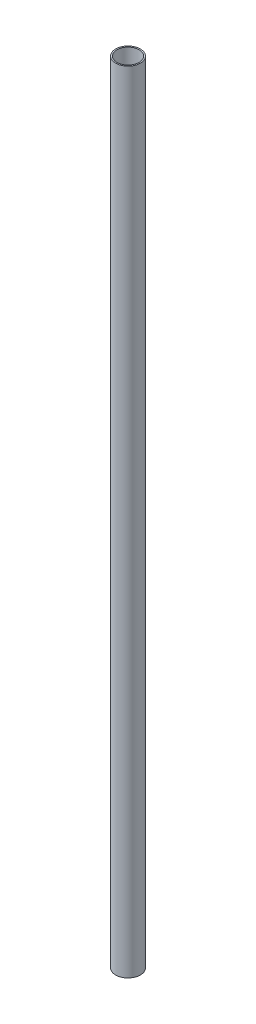
ISO-10303-21;
HEADER;
FILE_DESCRIPTION(('STEP AP214'),'2;1');
FILE_NAME('part.step','',(''),(''),'','','');
FILE_SCHEMA(('AUTOMOTIVE_DESIGN { 1 0 10303 214 1 1 1 1 }'));
ENDSEC;
DATA;
#1=APPLICATION_CONTEXT('core data for automotive mechanical design processes');
#2=APPLICATION_PROTOCOL_DEFINITION('international standard','automotive_design',2000,#1);
#3=PRODUCT_CONTEXT('',#1,'mechanical');
#4=PRODUCT('Part','Part','',(#3));
#5=PRODUCT_RELATED_PRODUCT_CATEGORY('part','',(#4));
#6=PRODUCT_DEFINITION_FORMATION('','',#4);
#7=PRODUCT_DEFINITION_CONTEXT('part definition',#1,'design');
#8=PRODUCT_DEFINITION('design','',#6,#7);
#9=PRODUCT_DEFINITION_SHAPE('','',#8);
#10=(LENGTH_UNIT() NAMED_UNIT(*) SI_UNIT(.MILLI.,.METRE.));
#11=(NAMED_UNIT(*) PLANE_ANGLE_UNIT() SI_UNIT($,.RADIAN.));
#12=(NAMED_UNIT(*) SI_UNIT($,.STERADIAN.) SOLID_ANGLE_UNIT());
#13=UNCERTAINTY_MEASURE_WITH_UNIT(LENGTH_MEASURE(1.E-05),#10,'distance_accuracy_value','');
#14=(GEOMETRIC_REPRESENTATION_CONTEXT(3) GLOBAL_UNCERTAINTY_ASSIGNED_CONTEXT((#13)) GLOBAL_UNIT_ASSIGNED_CONTEXT((#10,
#11,#12)) REPRESENTATION_CONTEXT('',''));
#15=CARTESIAN_POINT('',(0.,0.,0.));
#16=DIRECTION('',(0.,0.,1.));
#17=DIRECTION('',(1.,0.,0.));
#18=AXIS2_PLACEMENT_3D('',#15,#16,#17);
#19=CARTESIAN_POINT('',(0.,304.8,0.));
#20=DIRECTION('',(0.,1.,0.));
#21=DIRECTION('',(0.,0.,1.));
#22=AXIS2_PLACEMENT_3D('',#19,#20,#21);
#23=PLANE('',#22);
#24=CARTESIAN_POINT('',(0.,304.8,0.));
#25=DIRECTION('',(0.,1.,0.));
#26=DIRECTION('',(0.,0.,1.));
#27=AXIS2_PLACEMENT_3D('',#24,#25,#26);
#28=CIRCLE('',#27,4.7625);
#29=CARTESIAN_POINT('',(0.,304.8,-4.7625));
#30=VERTEX_POINT('',#29);
#31=EDGE_CURVE('E10',#30,#30,#28,.T.);
#32=ORIENTED_EDGE('',*,*,#31,.T.);
#33=EDGE_LOOP('',(#32));
#34=FACE_BOUND('',#33,.T.);
#35=CARTESIAN_POINT('',(0.,304.8,0.));
#36=DIRECTION('',(0.,1.,0.));
#37=DIRECTION('',(0.,0.,1.));
#38=AXIS2_PLACEMENT_3D('',#35,#36,#37);
#39=CIRCLE('',#38,4.2545);
#40=CARTESIAN_POINT('',(0.,304.8,-4.2545));
#41=VERTEX_POINT('',#40);
#42=EDGE_CURVE('E50',#41,#41,#39,.T.);
#43=ORIENTED_EDGE('',*,*,#42,.F.);
#44=EDGE_LOOP('',(#43));
#45=FACE_BOUND('',#44,.T.);
#46=ADVANCED_FACE('F37',(#34,#45),#23,.T.);
#47=CARTESIAN_POINT('',(0.,0.,0.));
#48=DIRECTION('',(0.,1.,0.));
#49=DIRECTION('',(0.,0.,1.));
#50=AXIS2_PLACEMENT_3D('',#47,#48,#49);
#51=PLANE('',#50);
#52=CARTESIAN_POINT('',(0.,0.,0.));
#53=DIRECTION('',(0.,1.,0.));
#54=DIRECTION('',(0.,0.,1.));
#55=AXIS2_PLACEMENT_3D('',#52,#53,#54);
#56=CIRCLE('',#55,4.7625);
#57=CARTESIAN_POINT('',(0.,0.,-4.7625));
#58=VERTEX_POINT('',#57);
#59=EDGE_CURVE('E41',#58,#58,#56,.T.);
#60=ORIENTED_EDGE('',*,*,#59,.F.);
#61=EDGE_LOOP('',(#60));
#62=FACE_BOUND('',#61,.T.);
#63=CARTESIAN_POINT('',(0.,0.,0.));
#64=DIRECTION('',(0.,1.,0.));
#65=DIRECTION('',(0.,0.,1.));
#66=AXIS2_PLACEMENT_3D('',#63,#64,#65);
#67=CIRCLE('',#66,4.2545);
#68=CARTESIAN_POINT('',(0.,0.,-4.2545));
#69=VERTEX_POINT('',#68);
#70=EDGE_CURVE('E52',#69,#69,#67,.T.);
#71=ORIENTED_EDGE('',*,*,#70,.T.);
#72=EDGE_LOOP('',(#71));
#73=FACE_BOUND('',#72,.T.);
#74=ADVANCED_FACE('F64',(#62,#73),#51,.F.);
#75=CARTESIAN_POINT('',(0.,304.8,0.));
#76=DIRECTION('',(0.,-1.,0.));
#77=DIRECTION('',(0.,0.,-1.));
#78=AXIS2_PLACEMENT_3D('',#75,#76,#77);
#79=CYLINDRICAL_SURFACE('',#78,4.7625);
#80=CARTESIAN_POINT('',(0.,304.8,-4.7625));
#81=CARTESIAN_POINT('',(0.,301.625,-4.7625));
#82=CARTESIAN_POINT('',(0.,298.45,-4.7625));
#83=CARTESIAN_POINT('',(0.,292.1,-4.7625));
#84=CARTESIAN_POINT('',(0.,288.925,-4.7625));
#85=CARTESIAN_POINT('',(0.,282.575,-4.7625));
#86=CARTESIAN_POINT('',(0.,279.4,-4.7625));
#87=CARTESIAN_POINT('',(0.,273.05,-4.7625));
#88=CARTESIAN_POINT('',(0.,269.875,-4.7625));
#89=CARTESIAN_POINT('',(0.,263.525,-4.7625));
#90=CARTESIAN_POINT('',(0.,260.35,-4.7625));
#91=CARTESIAN_POINT('',(0.,254.,-4.7625));
#92=CARTESIAN_POINT('',(0.,250.825,-4.7625));
#93=CARTESIAN_POINT('',(0.,244.475,-4.7625));
#94=CARTESIAN_POINT('',(0.,241.3,-4.7625));
#95=CARTESIAN_POINT('',(0.,234.95,-4.7625));
#96=CARTESIAN_POINT('',(0.,231.775,-4.7625));
#97=CARTESIAN_POINT('',(0.,225.425,-4.7625));
#98=CARTESIAN_POINT('',(0.,222.25,-4.7625));
#99=CARTESIAN_POINT('',(0.,215.9,-4.7625));
#100=CARTESIAN_POINT('',(0.,212.725,-4.7625));
#101=CARTESIAN_POINT('',(0.,206.375,-4.7625));
#102=CARTESIAN_POINT('',(0.,203.2,-4.7625));
#103=CARTESIAN_POINT('',(0.,196.85,-4.7625));
#104=CARTESIAN_POINT('',(0.,193.675,-4.7625));
#105=CARTESIAN_POINT('',(0.,187.325,-4.7625));
#106=CARTESIAN_POINT('',(0.,184.15,-4.7625));
#107=CARTESIAN_POINT('',(0.,177.8,-4.7625));
#108=CARTESIAN_POINT('',(0.,174.625,-4.7625));
#109=CARTESIAN_POINT('',(0.,168.275,-4.7625));
#110=CARTESIAN_POINT('',(0.,165.1,-4.7625));
#111=CARTESIAN_POINT('',(0.,158.75,-4.7625));
#112=CARTESIAN_POINT('',(0.,155.575,-4.7625));
#113=CARTESIAN_POINT('',(0.,149.225,-4.7625));
#114=CARTESIAN_POINT('',(0.,146.05,-4.7625));
#115=CARTESIAN_POINT('',(0.,139.7,-4.7625));
#116=CARTESIAN_POINT('',(0.,136.525,-4.7625));
#117=CARTESIAN_POINT('',(0.,130.175,-4.7625));
#118=CARTESIAN_POINT('',(0.,127.,-4.7625));
#119=CARTESIAN_POINT('',(0.,120.65,-4.7625));
#120=CARTESIAN_POINT('',(0.,117.475,-4.7625));
#121=CARTESIAN_POINT('',(0.,111.125,-4.7625));
#122=CARTESIAN_POINT('',(0.,107.95,-4.7625));
#123=CARTESIAN_POINT('',(0.,101.6,-4.7625));
#124=CARTESIAN_POINT('',(0.,98.425,-4.7625));
#125=CARTESIAN_POINT('',(0.,92.075,-4.7625));
#126=CARTESIAN_POINT('',(0.,88.9,-4.7625));
#127=CARTESIAN_POINT('',(0.,82.55,-4.7625));
#128=CARTESIAN_POINT('',(0.,79.375,-4.7625));
#129=CARTESIAN_POINT('',(0.,73.025,-4.7625));
#130=CARTESIAN_POINT('',(0.,69.85,-4.7625));
#131=CARTESIAN_POINT('',(0.,63.5,-4.7625));
#132=CARTESIAN_POINT('',(0.,60.325,-4.7625));
#133=CARTESIAN_POINT('',(0.,53.975,-4.7625));
#134=CARTESIAN_POINT('',(0.,50.8,-4.7625));
#135=CARTESIAN_POINT('',(0.,44.45,-4.7625));
#136=CARTESIAN_POINT('',(0.,41.275,-4.7625));
#137=CARTESIAN_POINT('',(0.,34.925,-4.7625));
#138=CARTESIAN_POINT('',(0.,31.75,-4.7625));
#139=CARTESIAN_POINT('',(0.,25.4,-4.7625));
#140=CARTESIAN_POINT('',(0.,22.225,-4.7625));
#141=CARTESIAN_POINT('',(0.,15.875,-4.7625));
#142=CARTESIAN_POINT('',(0.,12.7,-4.7625));
#143=CARTESIAN_POINT('',(0.,6.35,-4.7625));
#144=CARTESIAN_POINT('',(0.,3.175,-4.7625));
#145=CARTESIAN_POINT('',(0.,0.,-4.7625));
#146=B_SPLINE_CURVE_WITH_KNOTS('',3,(#80,#81,#82,#83,#84,#85,#86,#87,#88,#89,#90,#91,#92,#93,
#94,#95,#96,#97,#98,#99,#100,#101,#102,#103,#104,#105,#106,#107,#108,#109,#110,#111,#112,#113,
#114,#115,#116,#117,#118,#119,#120,#121,#122,#123,#124,#125,#126,#127,#128,#129,#130,#131,#132,
#133,#134,#135,#136,#137,#138,#139,#140,#141,#142,#143,#144,#145),.UNSPECIFIED.,.F.,.F.,(4,2,2,
2,2,2,2,2,2,2,2,2,2,2,2,2,2,2,2,2,2,2,2,2,2,2,2,2,2,2,2,2,4),(0.,9.52499999999995,19.05,28.575,
38.1,47.625,57.15,66.675,76.2,85.725,95.2499999999999,104.775,114.3,123.825,133.35,142.875,
152.4,161.925,171.45,180.975,190.5,200.025,209.55,219.075,228.6,238.125,247.65,257.175,266.7,
276.225,285.75,295.275,304.8),.UNSPECIFIED.);
#147=EDGE_CURVE('BSEAM39',#30,#58,#146,.T.);
#148=ORIENTED_EDGE('',*,*,#31,.F.);
#149=ORIENTED_EDGE('',*,*,#59,.T.);
#150=ORIENTED_EDGE('',*,*,#147,.T.);
#151=ORIENTED_EDGE('',*,*,#147,.F.);
#152=EDGE_LOOP('',(#148,#150,#149,#151));
#153=FACE_BOUND('',#152,.T.);
#154=ADVANCED_FACE('F39',(#153),#79,.T.);
#155=CARTESIAN_POINT('',(0.,304.8,0.));
#156=DIRECTION('',(0.,-1.,0.));
#157=DIRECTION('',(0.,0.,-1.));
#158=AXIS2_PLACEMENT_3D('',#155,#156,#157);
#159=CYLINDRICAL_SURFACE('',#158,4.2545);
#160=CARTESIAN_POINT('',(0.,304.8,-4.2545));
#161=CARTESIAN_POINT('',(0.,301.625,-4.2545));
#162=CARTESIAN_POINT('',(0.,298.45,-4.2545));
#163=CARTESIAN_POINT('',(0.,292.1,-4.2545));
#164=CARTESIAN_POINT('',(0.,288.925,-4.2545));
#165=CARTESIAN_POINT('',(0.,282.575,-4.2545));
#166=CARTESIAN_POINT('',(0.,279.4,-4.2545));
#167=CARTESIAN_POINT('',(0.,273.05,-4.2545));
#168=CARTESIAN_POINT('',(0.,269.875,-4.2545));
#169=CARTESIAN_POINT('',(0.,263.525,-4.2545));
#170=CARTESIAN_POINT('',(0.,260.35,-4.2545));
#171=CARTESIAN_POINT('',(0.,254.,-4.2545));
#172=CARTESIAN_POINT('',(0.,250.825,-4.2545));
#173=CARTESIAN_POINT('',(0.,244.475,-4.2545));
#174=CARTESIAN_POINT('',(0.,241.3,-4.2545));
#175=CARTESIAN_POINT('',(0.,234.95,-4.2545));
#176=CARTESIAN_POINT('',(0.,231.775,-4.2545));
#177=CARTESIAN_POINT('',(0.,225.425,-4.2545));
#178=CARTESIAN_POINT('',(0.,222.25,-4.2545));
#179=CARTESIAN_POINT('',(0.,215.9,-4.2545));
#180=CARTESIAN_POINT('',(0.,212.725,-4.2545));
#181=CARTESIAN_POINT('',(0.,206.375,-4.2545));
#182=CARTESIAN_POINT('',(0.,203.2,-4.2545));
#183=CARTESIAN_POINT('',(0.,196.85,-4.2545));
#184=CARTESIAN_POINT('',(0.,193.675,-4.2545));
#185=CARTESIAN_POINT('',(0.,187.325,-4.2545));
#186=CARTESIAN_POINT('',(0.,184.15,-4.2545));
#187=CARTESIAN_POINT('',(0.,177.8,-4.2545));
#188=CARTESIAN_POINT('',(0.,174.625,-4.2545));
#189=CARTESIAN_POINT('',(0.,168.275,-4.2545));
#190=CARTESIAN_POINT('',(0.,165.1,-4.2545));
#191=CARTESIAN_POINT('',(0.,158.75,-4.2545));
#192=CARTESIAN_POINT('',(0.,155.575,-4.2545));
#193=CARTESIAN_POINT('',(0.,149.225,-4.2545));
#194=CARTESIAN_POINT('',(0.,146.05,-4.2545));
#195=CARTESIAN_POINT('',(0.,139.7,-4.2545));
#196=CARTESIAN_POINT('',(0.,136.525,-4.2545));
#197=CARTESIAN_POINT('',(0.,130.175,-4.2545));
#198=CARTESIAN_POINT('',(0.,127.,-4.2545));
#199=CARTESIAN_POINT('',(0.,120.65,-4.2545));
#200=CARTESIAN_POINT('',(0.,117.475,-4.2545));
#201=CARTESIAN_POINT('',(0.,111.125,-4.2545));
#202=CARTESIAN_POINT('',(0.,107.95,-4.2545));
#203=CARTESIAN_POINT('',(0.,101.6,-4.2545));
#204=CARTESIAN_POINT('',(0.,98.425,-4.2545));
#205=CARTESIAN_POINT('',(0.,92.075,-4.2545));
#206=CARTESIAN_POINT('',(0.,88.9,-4.2545));
#207=CARTESIAN_POINT('',(0.,82.55,-4.2545));
#208=CARTESIAN_POINT('',(0.,79.375,-4.2545));
#209=CARTESIAN_POINT('',(0.,73.025,-4.2545));
#210=CARTESIAN_POINT('',(0.,69.85,-4.2545));
#211=CARTESIAN_POINT('',(0.,63.5,-4.2545));
#212=CARTESIAN_POINT('',(0.,60.325,-4.2545));
#213=CARTESIAN_POINT('',(0.,53.975,-4.2545));
#214=CARTESIAN_POINT('',(0.,50.8,-4.2545));
#215=CARTESIAN_POINT('',(0.,44.45,-4.2545));
#216=CARTESIAN_POINT('',(0.,41.275,-4.2545));
#217=CARTESIAN_POINT('',(0.,34.925,-4.2545));
#218=CARTESIAN_POINT('',(0.,31.75,-4.2545));
#219=CARTESIAN_POINT('',(0.,25.4,-4.2545));
#220=CARTESIAN_POINT('',(0.,22.225,-4.2545));
#221=CARTESIAN_POINT('',(0.,15.875,-4.2545));
#222=CARTESIAN_POINT('',(0.,12.7,-4.2545));
#223=CARTESIAN_POINT('',(0.,6.35,-4.2545));
#224=CARTESIAN_POINT('',(0.,3.175,-4.2545));
#225=CARTESIAN_POINT('',(0.,0.,-4.2545));
#226=B_SPLINE_CURVE_WITH_KNOTS('',3,(#160,#161,#162,#163,#164,#165,#166,#167,#168,#169,#170,
#171,#172,#173,#174,#175,#176,#177,#178,#179,#180,#181,#182,#183,#184,#185,#186,#187,#188,#189,
#190,#191,#192,#193,#194,#195,#196,#197,#198,#199,#200,#201,#202,#203,#204,#205,#206,#207,#208,
#209,#210,#211,#212,#213,#214,#215,#216,#217,#218,#219,#220,#221,#222,#223,#224,#225),
.UNSPECIFIED.,.F.,.F.,(4,2,2,2,2,2,2,2,2,2,2,2,2,2,2,2,2,2,2,2,2,2,2,2,2,2,2,2,2,2,2,2,4),(0.,
9.52500000000001,19.05,28.575,38.1,47.625,57.15,66.675,76.2,85.7250000000001,95.2500000000001,
104.775,114.3,123.825,133.35,142.875,152.4,161.925,171.45,180.975,190.5,200.025,209.55,219.075,
228.6,238.125,247.65,257.175,266.7,276.225,285.75,295.275,304.8),.UNSPECIFIED.);
#227=EDGE_CURVE('BSEAM60',#41,#69,#226,.T.);
#228=ORIENTED_EDGE('',*,*,#42,.T.);
#229=ORIENTED_EDGE('',*,*,#70,.F.);
#230=ORIENTED_EDGE('',*,*,#227,.T.);
#231=ORIENTED_EDGE('',*,*,#227,.F.);
#232=EDGE_LOOP('',(#228,#230,#229,#231));
#233=FACE_BOUND('',#232,.T.);
#234=ADVANCED_FACE('F60',(#233),#159,.F.);
#235=CLOSED_SHELL('',(#46,#74,#154,#234));
#236=MANIFOLD_SOLID_BREP('B2',#235);
#237=ADVANCED_BREP_SHAPE_REPRESENTATION('',(#18,#236),#14);
#238=SHAPE_DEFINITION_REPRESENTATION(#9,#237);
ENDSEC;
END-ISO-10303-21;
